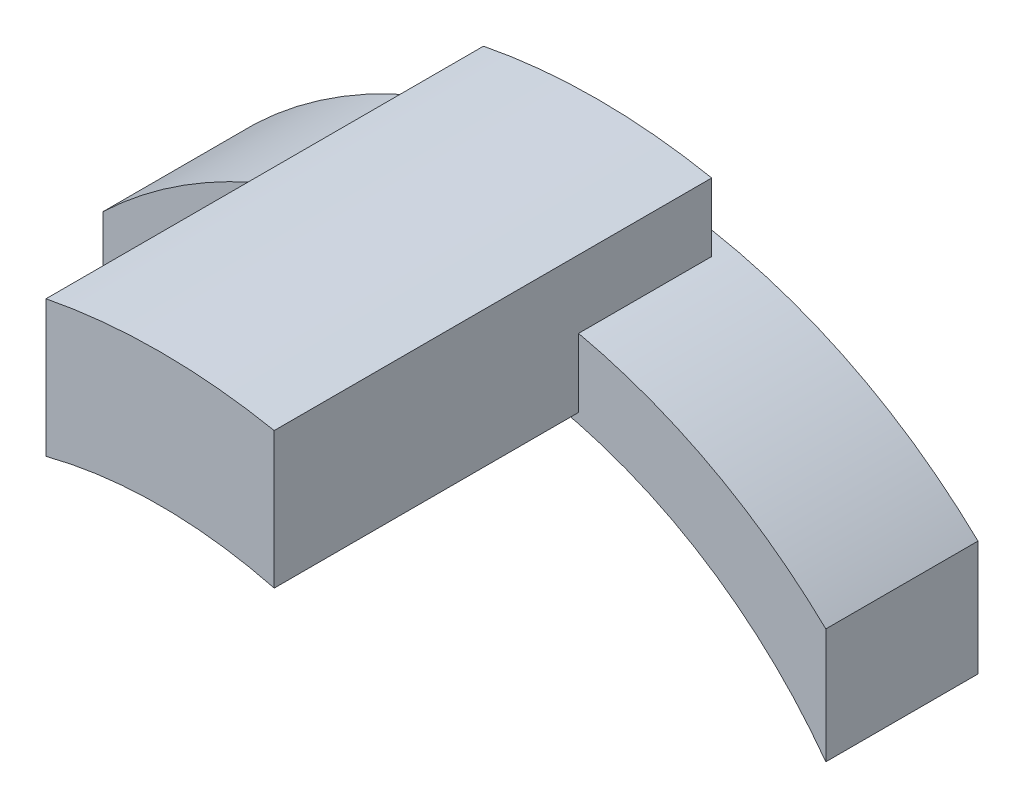
ISO-10303-21;
HEADER;
FILE_DESCRIPTION(('STEP AP214'),'2;1');
FILE_NAME('part.step','',(''),(''),'','','');
FILE_SCHEMA(('AUTOMOTIVE_DESIGN { 1 0 10303 214 1 1 1 1 }'));
ENDSEC;
DATA;
#1=APPLICATION_CONTEXT('core data for automotive mechanical design processes');
#2=APPLICATION_PROTOCOL_DEFINITION('international standard','automotive_design',2000,#1);
#3=PRODUCT_CONTEXT('',#1,'mechanical');
#4=PRODUCT('Part','Part','',(#3));
#5=PRODUCT_RELATED_PRODUCT_CATEGORY('part','',(#4));
#6=PRODUCT_DEFINITION_FORMATION('','',#4);
#7=PRODUCT_DEFINITION_CONTEXT('part definition',#1,'design');
#8=PRODUCT_DEFINITION('design','',#6,#7);
#9=PRODUCT_DEFINITION_SHAPE('','',#8);
#10=(LENGTH_UNIT() NAMED_UNIT(*) SI_UNIT(.MILLI.,.METRE.));
#11=(NAMED_UNIT(*) PLANE_ANGLE_UNIT() SI_UNIT($,.RADIAN.));
#12=(NAMED_UNIT(*) SI_UNIT($,.STERADIAN.) SOLID_ANGLE_UNIT());
#13=UNCERTAINTY_MEASURE_WITH_UNIT(LENGTH_MEASURE(1.E-05),#10,'distance_accuracy_value','');
#14=(GEOMETRIC_REPRESENTATION_CONTEXT(3) GLOBAL_UNCERTAINTY_ASSIGNED_CONTEXT((#13)) GLOBAL_UNIT_ASSIGNED_CONTEXT((#10,
#11,#12)) REPRESENTATION_CONTEXT('',''));
#15=CARTESIAN_POINT('',(0.,0.,0.));
#16=DIRECTION('',(0.,0.,1.));
#17=DIRECTION('',(1.,0.,0.));
#18=AXIS2_PLACEMENT_3D('',#15,#16,#17);
#19=CARTESIAN_POINT('',(0.,0.,4.));
#20=DIRECTION('',(0.,0.,-1.));
#21=DIRECTION('',(-1.,0.,0.));
#22=AXIS2_PLACEMENT_3D('',#19,#20,#21);
#23=CYLINDRICAL_SURFACE('',#22,27.5);
#24=DIRECTION('',(0.,0.,-1.));
#25=VECTOR('',#24,1.);
#26=CARTESIAN_POINT('',(-5.99999999999999,26.8374738006393,4.));
#27=LINE('',#26,#25);
#28=CARTESIAN_POINT('',(-5.99999999999999,26.8374738006393,-3.));
#29=VERTEX_POINT('',#28);
#30=CARTESIAN_POINT('',(-5.99999999999999,26.8374738006393,4.));
#31=VERTEX_POINT('',#30);
#32=EDGE_CURVE('E183',#29,#31,#27,.F.);
#33=ORIENTED_EDGE('',*,*,#32,.F.);
#34=CARTESIAN_POINT('',(0.,0.,-3.));
#35=DIRECTION('',(0.,0.,-1.));
#36=DIRECTION('',(-1.,0.,0.));
#37=AXIS2_PLACEMENT_3D('',#34,#35,#36);
#38=CIRCLE('',#37,27.5);
#39=CARTESIAN_POINT('',(6.00000000000001,26.8374738006393,-3.));
#40=VERTEX_POINT('',#39);
#41=EDGE_CURVE('E11',#29,#40,#38,.T.);
#42=ORIENTED_EDGE('',*,*,#41,.T.);
#43=DIRECTION('',(0.,0.,-1.));
#44=VECTOR('',#43,1.);
#45=CARTESIAN_POINT('',(6.00000000000001,26.8374738006393,4.));
#46=LINE('',#45,#44);
#47=CARTESIAN_POINT('',(6.00000000000001,26.8374738006393,4.));
#48=VERTEX_POINT('',#47);
#49=EDGE_CURVE('E142',#48,#40,#46,.T.);
#50=ORIENTED_EDGE('',*,*,#49,.F.);
#51=CARTESIAN_POINT('',(0.,0.,4.));
#52=DIRECTION('',(0.,0.,1.));
#53=DIRECTION('',(1.,0.,0.));
#54=AXIS2_PLACEMENT_3D('',#51,#52,#53);
#55=CIRCLE('',#54,27.5);
#56=CARTESIAN_POINT('',(19.,19.880895352071,4.));
#57=VERTEX_POINT('',#56);
#58=EDGE_CURVE('E193',#57,#48,#55,.T.);
#59=ORIENTED_EDGE('',*,*,#58,.F.);
#60=DIRECTION('',(0.,0.,-1.));
#61=VECTOR('',#60,1.);
#62=CARTESIAN_POINT('',(19.,19.880895352071,4.));
#63=LINE('',#62,#61);
#64=CARTESIAN_POINT('',(19.,19.880895352071,-4.));
#65=VERTEX_POINT('',#64);
#66=EDGE_CURVE('E216',#57,#65,#63,.T.);
#67=ORIENTED_EDGE('',*,*,#66,.T.);
#68=CARTESIAN_POINT('',(0.,0.,-4.));
#69=DIRECTION('',(0.,0.,1.));
#70=DIRECTION('',(1.,0.,0.));
#71=AXIS2_PLACEMENT_3D('',#68,#69,#70);
#72=CIRCLE('',#71,27.5);
#73=CARTESIAN_POINT('',(-19.,19.880895352071,-4.));
#74=VERTEX_POINT('',#73);
#75=EDGE_CURVE('E206',#65,#74,#72,.T.);
#76=ORIENTED_EDGE('',*,*,#75,.T.);
#77=DIRECTION('',(0.,0.,-1.));
#78=VECTOR('',#77,1.);
#79=CARTESIAN_POINT('',(-19.,19.880895352071,4.));
#80=LINE('',#79,#78);
#81=CARTESIAN_POINT('',(-19.,19.880895352071,4.));
#82=VERTEX_POINT('',#81);
#83=EDGE_CURVE('E213',#82,#74,#80,.T.);
#84=ORIENTED_EDGE('',*,*,#83,.F.);
#85=EDGE_CURVE('E192',#31,#82,#55,.T.);
#86=ORIENTED_EDGE('',*,*,#85,.F.);
#87=EDGE_LOOP('',(#33,#42,#50,#59,#67,#76,#84,#86));
#88=FACE_BOUND('',#87,.T.);
#89=ADVANCED_FACE('F43',(#88),#23,.T.);
#90=CARTESIAN_POINT('',(0.,0.,4.));
#91=DIRECTION('',(0.,0.,1.));
#92=DIRECTION('',(1.,0.,0.));
#93=AXIS2_PLACEMENT_3D('',#90,#91,#92);
#94=PLANE('',#93);
#95=CARTESIAN_POINT('',(0.,0.,4.));
#96=DIRECTION('',(0.,0.,1.));
#97=DIRECTION('',(1.,0.,0.));
#98=AXIS2_PLACEMENT_3D('',#95,#96,#97);
#99=CIRCLE('',#98,24.);
#100=CARTESIAN_POINT('',(6.00000000000001,23.2379000772445,4.));
#101=VERTEX_POINT('',#100);
#102=CARTESIAN_POINT('',(-5.99999999999999,23.2379000772445,4.));
#103=VERTEX_POINT('',#102);
#104=EDGE_CURVE('E227',#101,#103,#99,.T.);
#105=ORIENTED_EDGE('',*,*,#104,.T.);
#106=DIRECTION('',(0.,1.,0.));
#107=VECTOR('',#106,1.);
#108=CARTESIAN_POINT('',(-5.99999999999999,0.,4.));
#109=LINE('',#108,#107);
#110=EDGE_CURVE('E52',#103,#31,#109,.T.);
#111=ORIENTED_EDGE('',*,*,#110,.T.);
#112=ORIENTED_EDGE('',*,*,#85,.T.);
#113=DIRECTION('',(0.,-1.,0.));
#114=VECTOR('',#113,1.);
#115=CARTESIAN_POINT('',(-19.,13.8293166859393,4.));
#116=LINE('',#115,#114);
#117=CARTESIAN_POINT('',(-19.,13.8293166859393,4.));
#118=VERTEX_POINT('',#117);
#119=EDGE_CURVE('E68',#82,#118,#116,.T.);
#120=ORIENTED_EDGE('',*,*,#119,.T.);
#121=CARTESIAN_POINT('',(0.,0.,4.));
#122=DIRECTION('',(0.,0.,-1.));
#123=DIRECTION('',(1.,0.,0.));
#124=AXIS2_PLACEMENT_3D('',#121,#122,#123);
#125=CIRCLE('',#124,23.5);
#126=CARTESIAN_POINT('',(19.,13.8293166859393,4.));
#127=VERTEX_POINT('',#126);
#128=EDGE_CURVE('E187',#118,#127,#125,.T.);
#129=ORIENTED_EDGE('',*,*,#128,.T.);
#130=DIRECTION('',(0.,1.,0.));
#131=VECTOR('',#130,1.);
#132=CARTESIAN_POINT('',(19.,19.880895352071,4.));
#133=LINE('',#132,#131);
#134=EDGE_CURVE('E97',#127,#57,#133,.T.);
#135=ORIENTED_EDGE('',*,*,#134,.T.);
#136=ORIENTED_EDGE('',*,*,#58,.T.);
#137=DIRECTION('',(0.,-1.,0.));
#138=VECTOR('',#137,1.);
#139=CARTESIAN_POINT('',(6.00000000000001,0.,4.));
#140=LINE('',#139,#138);
#141=EDGE_CURVE('E223',#48,#101,#140,.T.);
#142=ORIENTED_EDGE('',*,*,#141,.T.);
#143=EDGE_LOOP('',(#105,#111,#112,#120,#129,#135,#136,#142));
#144=FACE_BOUND('',#143,.T.);
#145=ADVANCED_FACE('F231',(#144),#94,.T.);
#146=CARTESIAN_POINT('',(0.,0.,4.));
#147=DIRECTION('',(0.,0.,-1.));
#148=DIRECTION('',(-1.,0.,0.));
#149=AXIS2_PLACEMENT_3D('',#146,#147,#148);
#150=CYLINDRICAL_SURFACE('',#149,23.5);
#151=CARTESIAN_POINT('',(0.,0.,-4.));
#152=DIRECTION('',(0.,0.,-1.));
#153=DIRECTION('',(1.,0.,0.));
#154=AXIS2_PLACEMENT_3D('',#151,#152,#153);
#155=CIRCLE('',#154,23.5);
#156=CARTESIAN_POINT('',(-19.,13.8293166859393,-4.));
#157=VERTEX_POINT('',#156);
#158=CARTESIAN_POINT('',(19.,13.8293166859393,-4.));
#159=VERTEX_POINT('',#158);
#160=EDGE_CURVE('E186',#157,#159,#155,.T.);
#161=ORIENTED_EDGE('',*,*,#160,.T.);
#162=DIRECTION('',(0.,0.,-1.));
#163=VECTOR('',#162,1.);
#164=CARTESIAN_POINT('',(19.,13.8293166859393,4.));
#165=LINE('',#164,#163);
#166=EDGE_CURVE('E220',#127,#159,#165,.T.);
#167=ORIENTED_EDGE('',*,*,#166,.F.);
#168=ORIENTED_EDGE('',*,*,#128,.F.);
#169=DIRECTION('',(0.,0.,-1.));
#170=VECTOR('',#169,1.);
#171=CARTESIAN_POINT('',(-19.,13.8293166859393,4.));
#172=LINE('',#171,#170);
#173=EDGE_CURVE('E199',#118,#157,#172,.T.);
#174=ORIENTED_EDGE('',*,*,#173,.T.);
#175=EDGE_LOOP('',(#161,#167,#168,#174));
#176=FACE_BOUND('',#175,.T.);
#177=ADVANCED_FACE('F45',(#176),#150,.F.);
#178=CARTESIAN_POINT('',(19.,19.880895352071,4.));
#179=DIRECTION('',(-1.,0.,0.));
#180=DIRECTION('',(0.,0.,1.));
#181=AXIS2_PLACEMENT_3D('',#178,#179,#180);
#182=PLANE('',#181);
#183=DIRECTION('',(0.,1.,0.));
#184=VECTOR('',#183,1.);
#185=CARTESIAN_POINT('',(19.,19.880895352071,-4.));
#186=LINE('',#185,#184);
#187=EDGE_CURVE('E203',#159,#65,#186,.T.);
#188=ORIENTED_EDGE('',*,*,#187,.T.);
#189=ORIENTED_EDGE('',*,*,#66,.F.);
#190=ORIENTED_EDGE('',*,*,#134,.F.);
#191=ORIENTED_EDGE('',*,*,#166,.T.);
#192=EDGE_LOOP('',(#188,#189,#190,#191));
#193=FACE_BOUND('',#192,.T.);
#194=ADVANCED_FACE('F243',(#193),#182,.F.);
#195=CARTESIAN_POINT('',(-19.,13.8293166859393,4.));
#196=DIRECTION('',(1.,0.,0.));
#197=DIRECTION('',(0.,0.,-1.));
#198=AXIS2_PLACEMENT_3D('',#195,#196,#197);
#199=PLANE('',#198);
#200=DIRECTION('',(0.,-1.,0.));
#201=VECTOR('',#200,1.);
#202=CARTESIAN_POINT('',(-19.,13.8293166859393,-4.));
#203=LINE('',#202,#201);
#204=EDGE_CURVE('E89',#74,#157,#203,.T.);
#205=ORIENTED_EDGE('',*,*,#204,.T.);
#206=ORIENTED_EDGE('',*,*,#173,.F.);
#207=ORIENTED_EDGE('',*,*,#119,.F.);
#208=ORIENTED_EDGE('',*,*,#83,.T.);
#209=EDGE_LOOP('',(#205,#206,#207,#208));
#210=FACE_BOUND('',#209,.T.);
#211=ADVANCED_FACE('F237',(#210),#199,.F.);
#212=CARTESIAN_POINT('',(0.,0.,-4.));
#213=DIRECTION('',(0.,0.,1.));
#214=DIRECTION('',(1.,0.,0.));
#215=AXIS2_PLACEMENT_3D('',#212,#213,#214);
#216=PLANE('',#215);
#217=ORIENTED_EDGE('',*,*,#160,.F.);
#218=ORIENTED_EDGE('',*,*,#204,.F.);
#219=ORIENTED_EDGE('',*,*,#75,.F.);
#220=ORIENTED_EDGE('',*,*,#187,.F.);
#221=EDGE_LOOP('',(#217,#218,#219,#220));
#222=FACE_BOUND('',#221,.T.);
#223=ADVANCED_FACE('F276',(#222),#216,.F.);
#224=CARTESIAN_POINT('',(0.,0.,-3.));
#225=DIRECTION('',(0.,0.,-1.));
#226=DIRECTION('',(-1.,0.,0.));
#227=AXIS2_PLACEMENT_3D('',#224,#225,#226);
#228=PLANE('',#227);
#229=ORIENTED_EDGE('',*,*,#41,.F.);
#230=DIRECTION('',(0.,1.,0.));
#231=VECTOR('',#230,1.);
#232=CARTESIAN_POINT('',(-5.99999999999999,23.2379000772445,-3.));
#233=LINE('',#232,#231);
#234=CARTESIAN_POINT('',(-5.99999999999999,30.4138126514911,-3.));
#235=VERTEX_POINT('',#234);
#236=EDGE_CURVE('E164',#29,#235,#233,.T.);
#237=ORIENTED_EDGE('',*,*,#236,.T.);
#238=CARTESIAN_POINT('',(0.,0.,-3.));
#239=DIRECTION('',(0.,0.,-1.));
#240=DIRECTION('',(-1.,0.,0.));
#241=AXIS2_PLACEMENT_3D('',#238,#239,#240);
#242=CIRCLE('',#241,31.);
#243=CARTESIAN_POINT('',(6.00000000000001,30.4138126514911,-3.));
#244=VERTEX_POINT('',#243);
#245=EDGE_CURVE('E167',#235,#244,#242,.T.);
#246=ORIENTED_EDGE('',*,*,#245,.T.);
#247=DIRECTION('',(0.,-1.,0.));
#248=VECTOR('',#247,1.);
#249=CARTESIAN_POINT('',(6.00000000000001,30.4138126514911,-3.));
#250=LINE('',#249,#248);
#251=EDGE_CURVE('E170',#244,#40,#250,.T.);
#252=ORIENTED_EDGE('',*,*,#251,.T.);
#253=EDGE_LOOP('',(#229,#237,#246,#252));
#254=FACE_BOUND('',#253,.T.);
#255=ADVANCED_FACE('F248',(#254),#228,.T.);
#256=CARTESIAN_POINT('',(-5.99999999999999,23.2379000772445,-3.));
#257=DIRECTION('',(1.,0.,0.));
#258=DIRECTION('',(0.,0.,-1.));
#259=AXIS2_PLACEMENT_3D('',#256,#257,#258);
#260=PLANE('',#259);
#261=ORIENTED_EDGE('',*,*,#236,.F.);
#262=ORIENTED_EDGE('',*,*,#32,.T.);
#263=ORIENTED_EDGE('',*,*,#110,.F.);
#264=DIRECTION('',(0.,0.,1.));
#265=VECTOR('',#264,1.);
#266=CARTESIAN_POINT('',(-5.99999999999999,23.2379000772445,-3.));
#267=LINE('',#266,#265);
#268=CARTESIAN_POINT('',(-5.99999999999999,23.2379000772445,20.));
#269=VERTEX_POINT('',#268);
#270=EDGE_CURVE('E131',#103,#269,#267,.T.);
#271=ORIENTED_EDGE('',*,*,#270,.T.);
#272=DIRECTION('',(0.,1.,0.));
#273=VECTOR('',#272,1.);
#274=CARTESIAN_POINT('',(-5.99999999999999,23.2379000772445,20.));
#275=LINE('',#274,#273);
#276=CARTESIAN_POINT('',(-5.99999999999999,30.4138126514911,20.));
#277=VERTEX_POINT('',#276);
#278=EDGE_CURVE('E136',#269,#277,#275,.T.);
#279=ORIENTED_EDGE('',*,*,#278,.T.);
#280=DIRECTION('',(0.,0.,1.));
#281=VECTOR('',#280,1.);
#282=CARTESIAN_POINT('',(-5.99999999999999,30.4138126514911,-3.));
#283=LINE('',#282,#281);
#284=EDGE_CURVE('E143',#235,#277,#283,.T.);
#285=ORIENTED_EDGE('',*,*,#284,.F.);
#286=EDGE_LOOP('',(#261,#262,#263,#271,#279,#285));
#287=FACE_BOUND('',#286,.T.);
#288=ADVANCED_FACE('F134',(#287),#260,.F.);
#289=CARTESIAN_POINT('',(6.00000000000001,30.4138126514911,-3.));
#290=DIRECTION('',(-1.,0.,0.));
#291=DIRECTION('',(0.,0.,1.));
#292=AXIS2_PLACEMENT_3D('',#289,#290,#291);
#293=PLANE('',#292);
#294=ORIENTED_EDGE('',*,*,#141,.F.);
#295=ORIENTED_EDGE('',*,*,#49,.T.);
#296=ORIENTED_EDGE('',*,*,#251,.F.);
#297=DIRECTION('',(0.,0.,1.));
#298=VECTOR('',#297,1.);
#299=CARTESIAN_POINT('',(6.00000000000001,30.4138126514911,-3.));
#300=LINE('',#299,#298);
#301=CARTESIAN_POINT('',(6.00000000000001,30.4138126514911,20.));
#302=VERTEX_POINT('',#301);
#303=EDGE_CURVE('E176',#244,#302,#300,.T.);
#304=ORIENTED_EDGE('',*,*,#303,.T.);
#305=DIRECTION('',(0.,-1.,0.));
#306=VECTOR('',#305,1.);
#307=CARTESIAN_POINT('',(6.00000000000001,30.4138126514911,20.));
#308=LINE('',#307,#306);
#309=CARTESIAN_POINT('',(6.00000000000001,23.2379000772445,20.));
#310=VERTEX_POINT('',#309);
#311=EDGE_CURVE('E161',#302,#310,#308,.T.);
#312=ORIENTED_EDGE('',*,*,#311,.T.);
#313=DIRECTION('',(0.,0.,1.));
#314=VECTOR('',#313,1.);
#315=CARTESIAN_POINT('',(6.00000000000001,23.2379000772445,-3.));
#316=LINE('',#315,#314);
#317=EDGE_CURVE('E59',#101,#310,#316,.T.);
#318=ORIENTED_EDGE('',*,*,#317,.F.);
#319=EDGE_LOOP('',(#294,#295,#296,#304,#312,#318));
#320=FACE_BOUND('',#319,.T.);
#321=ADVANCED_FACE('F246',(#320),#293,.F.);
#322=CARTESIAN_POINT('',(0.,0.,-3.));
#323=DIRECTION('',(0.,0.,1.));
#324=DIRECTION('',(1.,0.,0.));
#325=AXIS2_PLACEMENT_3D('',#322,#323,#324);
#326=CYLINDRICAL_SURFACE('',#325,24.);
#327=ORIENTED_EDGE('',*,*,#104,.F.);
#328=ORIENTED_EDGE('',*,*,#317,.T.);
#329=CARTESIAN_POINT('',(0.,0.,20.));
#330=DIRECTION('',(0.,0.,1.));
#331=DIRECTION('',(-1.,0.,0.));
#332=AXIS2_PLACEMENT_3D('',#329,#330,#331);
#333=CIRCLE('',#332,24.);
#334=EDGE_CURVE('E150',#310,#269,#333,.T.);
#335=ORIENTED_EDGE('',*,*,#334,.T.);
#336=ORIENTED_EDGE('',*,*,#270,.F.);
#337=EDGE_LOOP('',(#327,#328,#335,#336));
#338=FACE_BOUND('',#337,.T.);
#339=ADVANCED_FACE('F155',(#338),#326,.F.);
#340=CARTESIAN_POINT('',(0.,0.,-3.));
#341=DIRECTION('',(0.,0.,1.));
#342=DIRECTION('',(1.,0.,0.));
#343=AXIS2_PLACEMENT_3D('',#340,#341,#342);
#344=CYLINDRICAL_SURFACE('',#343,31.);
#345=ORIENTED_EDGE('',*,*,#284,.T.);
#346=CARTESIAN_POINT('',(0.,0.,20.));
#347=DIRECTION('',(0.,0.,-1.));
#348=DIRECTION('',(-1.,0.,0.));
#349=AXIS2_PLACEMENT_3D('',#346,#347,#348);
#350=CIRCLE('',#349,31.);
#351=EDGE_CURVE('E152',#277,#302,#350,.T.);
#352=ORIENTED_EDGE('',*,*,#351,.T.);
#353=ORIENTED_EDGE('',*,*,#303,.F.);
#354=ORIENTED_EDGE('',*,*,#245,.F.);
#355=EDGE_LOOP('',(#345,#352,#353,#354));
#356=FACE_BOUND('',#355,.T.);
#357=ADVANCED_FACE('F252',(#356),#344,.T.);
#358=CARTESIAN_POINT('',(0.,0.,20.));
#359=DIRECTION('',(0.,0.,-1.));
#360=DIRECTION('',(-1.,0.,0.));
#361=AXIS2_PLACEMENT_3D('',#358,#359,#360);
#362=PLANE('',#361);
#363=ORIENTED_EDGE('',*,*,#334,.F.);
#364=ORIENTED_EDGE('',*,*,#311,.F.);
#365=ORIENTED_EDGE('',*,*,#351,.F.);
#366=ORIENTED_EDGE('',*,*,#278,.F.);
#367=EDGE_LOOP('',(#363,#364,#365,#366));
#368=FACE_BOUND('',#367,.T.);
#369=ADVANCED_FACE('F148',(#368),#362,.F.);
#370=CLOSED_SHELL('',(#89,#145,#177,#194,#211,#223,#255,#288,#321,#339,#357,#369));
#371=MANIFOLD_SOLID_BREP('B2',#370);
#372=ADVANCED_BREP_SHAPE_REPRESENTATION('',(#18,#371),#14);
#373=SHAPE_DEFINITION_REPRESENTATION(#9,#372);
ENDSEC;
END-ISO-10303-21;
